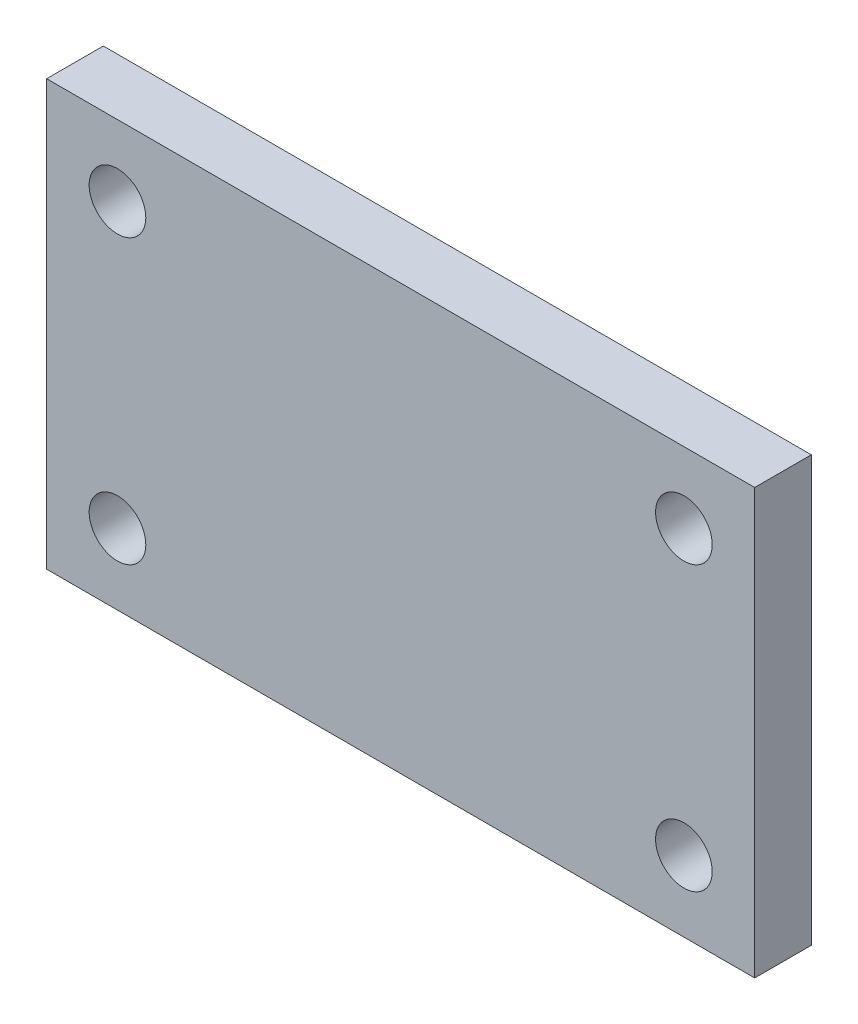
ISO-10303-21;
HEADER;
FILE_DESCRIPTION(('STEP AP214'),'2;1');
FILE_NAME('part.step','',(''),(''),'','','');
FILE_SCHEMA(('AUTOMOTIVE_DESIGN { 1 0 10303 214 1 1 1 1 }'));
ENDSEC;
DATA;
#1=APPLICATION_CONTEXT('core data for automotive mechanical design processes');
#2=APPLICATION_PROTOCOL_DEFINITION('international standard','automotive_design',2000,#1);
#3=PRODUCT_CONTEXT('',#1,'mechanical');
#4=PRODUCT('Part','Part','',(#3));
#5=PRODUCT_RELATED_PRODUCT_CATEGORY('part','',(#4));
#6=PRODUCT_DEFINITION_FORMATION('','',#4);
#7=PRODUCT_DEFINITION_CONTEXT('part definition',#1,'design');
#8=PRODUCT_DEFINITION('design','',#6,#7);
#9=PRODUCT_DEFINITION_SHAPE('','',#8);
#10=(LENGTH_UNIT() NAMED_UNIT(*) SI_UNIT(.MILLI.,.METRE.));
#11=(NAMED_UNIT(*) PLANE_ANGLE_UNIT() SI_UNIT($,.RADIAN.));
#12=(NAMED_UNIT(*) SI_UNIT($,.STERADIAN.) SOLID_ANGLE_UNIT());
#13=UNCERTAINTY_MEASURE_WITH_UNIT(LENGTH_MEASURE(1.E-05),#10,'distance_accuracy_value','');
#14=(GEOMETRIC_REPRESENTATION_CONTEXT(3) GLOBAL_UNCERTAINTY_ASSIGNED_CONTEXT((#13)) GLOBAL_UNIT_ASSIGNED_CONTEXT((#10,
#11,#12)) REPRESENTATION_CONTEXT('',''));
#15=CARTESIAN_POINT('',(0.,0.,0.));
#16=DIRECTION('',(0.,0.,1.));
#17=DIRECTION('',(1.,0.,0.));
#18=AXIS2_PLACEMENT_3D('',#15,#16,#17);
#19=CARTESIAN_POINT('',(40.,20.,0.));
#20=DIRECTION('',(0.,0.,-1.));
#21=DIRECTION('',(1.,0.,0.));
#22=AXIS2_PLACEMENT_3D('',#19,#20,#21);
#23=CYLINDRICAL_SURFACE('',#22,4.);
#24=CARTESIAN_POINT('',(40.,20.,0.));
#25=DIRECTION('',(0.,0.,1.));
#26=DIRECTION('',(1.,0.,0.));
#27=AXIS2_PLACEMENT_3D('',#24,#25,#26);
#28=CIRCLE('',#27,4.);
#29=CARTESIAN_POINT('',(44.,20.,0.));
#30=VERTEX_POINT('',#29);
#31=EDGE_CURVE('E65',#30,#30,#28,.T.);
#32=ORIENTED_EDGE('',*,*,#31,.F.);
#33=DIRECTION('',(0.,0.,1.));
#34=VECTOR('',#33,1.);
#35=CARTESIAN_POINT('',(44.,20.,0.));
#36=LINE('',#35,#34);
#37=CARTESIAN_POINT('',(44.,20.,8.));
#38=VERTEX_POINT('',#37);
#39=EDGE_CURVE('E10',#30,#38,#36,.T.);
#40=ORIENTED_EDGE('',*,*,#39,.T.);
#41=CARTESIAN_POINT('',(40.,20.,8.));
#42=DIRECTION('',(0.,0.,-1.));
#43=DIRECTION('',(1.,0.,0.));
#44=AXIS2_PLACEMENT_3D('',#41,#42,#43);
#45=CIRCLE('',#44,4.);
#46=EDGE_CURVE('E66',#38,#38,#45,.T.);
#47=ORIENTED_EDGE('',*,*,#46,.F.);
#48=ORIENTED_EDGE('',*,*,#39,.F.);
#49=EDGE_LOOP('',(#32,#40,#47,#48));
#50=FACE_BOUND('',#49,.T.);
#51=ADVANCED_FACE('F16',(#50),#23,.F.);
#52=CARTESIAN_POINT('',(-40.,20.,0.));
#53=DIRECTION('',(0.,0.,-1.));
#54=DIRECTION('',(1.,0.,0.));
#55=AXIS2_PLACEMENT_3D('',#52,#53,#54);
#56=CYLINDRICAL_SURFACE('',#55,4.);
#57=CARTESIAN_POINT('',(-40.,20.,0.));
#58=DIRECTION('',(0.,0.,1.));
#59=DIRECTION('',(1.,0.,0.));
#60=AXIS2_PLACEMENT_3D('',#57,#58,#59);
#61=CIRCLE('',#60,4.);
#62=CARTESIAN_POINT('',(-36.,20.,0.));
#63=VERTEX_POINT('',#62);
#64=EDGE_CURVE('E72',#63,#63,#61,.T.);
#65=ORIENTED_EDGE('',*,*,#64,.F.);
#66=DIRECTION('',(0.,0.,1.));
#67=VECTOR('',#66,1.);
#68=CARTESIAN_POINT('',(-36.,20.,0.));
#69=LINE('',#68,#67);
#70=CARTESIAN_POINT('',(-36.,20.,8.));
#71=VERTEX_POINT('',#70);
#72=EDGE_CURVE('E26',#63,#71,#69,.T.);
#73=ORIENTED_EDGE('',*,*,#72,.T.);
#74=CARTESIAN_POINT('',(-40.,20.,8.));
#75=DIRECTION('',(0.,0.,-1.));
#76=DIRECTION('',(1.,0.,0.));
#77=AXIS2_PLACEMENT_3D('',#74,#75,#76);
#78=CIRCLE('',#77,4.);
#79=EDGE_CURVE('E91',#71,#71,#78,.T.);
#80=ORIENTED_EDGE('',*,*,#79,.F.);
#81=ORIENTED_EDGE('',*,*,#72,.F.);
#82=EDGE_LOOP('',(#65,#73,#80,#81));
#83=FACE_BOUND('',#82,.T.);
#84=ADVANCED_FACE('F103',(#83),#56,.F.);
#85=CARTESIAN_POINT('',(40.,-20.,0.));
#86=DIRECTION('',(0.,0.,-1.));
#87=DIRECTION('',(1.,0.,0.));
#88=AXIS2_PLACEMENT_3D('',#85,#86,#87);
#89=CYLINDRICAL_SURFACE('',#88,4.);
#90=CARTESIAN_POINT('',(40.,-20.,0.));
#91=DIRECTION('',(0.,0.,1.));
#92=DIRECTION('',(1.,0.,0.));
#93=AXIS2_PLACEMENT_3D('',#90,#91,#92);
#94=CIRCLE('',#93,4.);
#95=CARTESIAN_POINT('',(44.,-20.,0.));
#96=VERTEX_POINT('',#95);
#97=EDGE_CURVE('E81',#96,#96,#94,.T.);
#98=ORIENTED_EDGE('',*,*,#97,.F.);
#99=DIRECTION('',(0.,0.,1.));
#100=VECTOR('',#99,1.);
#101=CARTESIAN_POINT('',(44.,-20.,0.));
#102=LINE('',#101,#100);
#103=CARTESIAN_POINT('',(44.,-20.,8.));
#104=VERTEX_POINT('',#103);
#105=EDGE_CURVE('E97',#96,#104,#102,.T.);
#106=ORIENTED_EDGE('',*,*,#105,.T.);
#107=CARTESIAN_POINT('',(40.,-20.,8.));
#108=DIRECTION('',(0.,0.,-1.));
#109=DIRECTION('',(1.,0.,0.));
#110=AXIS2_PLACEMENT_3D('',#107,#108,#109);
#111=CIRCLE('',#110,4.);
#112=EDGE_CURVE('E87',#104,#104,#111,.T.);
#113=ORIENTED_EDGE('',*,*,#112,.F.);
#114=ORIENTED_EDGE('',*,*,#105,.F.);
#115=EDGE_LOOP('',(#98,#106,#113,#114));
#116=FACE_BOUND('',#115,.T.);
#117=ADVANCED_FACE('F18',(#116),#89,.F.);
#118=CARTESIAN_POINT('',(-40.,-20.,0.));
#119=DIRECTION('',(0.,0.,-1.));
#120=DIRECTION('',(1.,0.,0.));
#121=AXIS2_PLACEMENT_3D('',#118,#119,#120);
#122=CYLINDRICAL_SURFACE('',#121,4.);
#123=CARTESIAN_POINT('',(-40.,-20.,0.));
#124=DIRECTION('',(0.,0.,1.));
#125=DIRECTION('',(1.,0.,0.));
#126=AXIS2_PLACEMENT_3D('',#123,#124,#125);
#127=CIRCLE('',#126,4.);
#128=CARTESIAN_POINT('',(-36.,-20.,0.));
#129=VERTEX_POINT('',#128);
#130=EDGE_CURVE('E147',#129,#129,#127,.T.);
#131=ORIENTED_EDGE('',*,*,#130,.F.);
#132=DIRECTION('',(0.,0.,1.));
#133=VECTOR('',#132,1.);
#134=CARTESIAN_POINT('',(-36.,-20.,0.));
#135=LINE('',#134,#133);
#136=CARTESIAN_POINT('',(-36.,-20.,8.));
#137=VERTEX_POINT('',#136);
#138=EDGE_CURVE('E94',#129,#137,#135,.T.);
#139=ORIENTED_EDGE('',*,*,#138,.T.);
#140=CARTESIAN_POINT('',(-40.,-20.,8.));
#141=DIRECTION('',(0.,0.,-1.));
#142=DIRECTION('',(1.,0.,0.));
#143=AXIS2_PLACEMENT_3D('',#140,#141,#142);
#144=CIRCLE('',#143,4.);
#145=EDGE_CURVE('E79',#137,#137,#144,.T.);
#146=ORIENTED_EDGE('',*,*,#145,.F.);
#147=ORIENTED_EDGE('',*,*,#138,.F.);
#148=EDGE_LOOP('',(#131,#139,#146,#147));
#149=FACE_BOUND('',#148,.T.);
#150=ADVANCED_FACE('F242',(#149),#122,.F.);
#151=CARTESIAN_POINT('',(50.,30.,0.));
#152=DIRECTION('',(0.,-1.,0.));
#153=DIRECTION('',(0.,0.,-1.));
#154=AXIS2_PLACEMENT_3D('',#151,#152,#153);
#155=PLANE('',#154);
#156=DIRECTION('',(-1.,0.,0.));
#157=VECTOR('',#156,1.);
#158=CARTESIAN_POINT('',(50.,30.,0.));
#159=LINE('',#158,#157);
#160=CARTESIAN_POINT('',(50.,30.,0.));
#161=VERTEX_POINT('',#160);
#162=CARTESIAN_POINT('',(-50.,30.,0.));
#163=VERTEX_POINT('',#162);
#164=EDGE_CURVE('E139',#161,#163,#159,.T.);
#165=ORIENTED_EDGE('',*,*,#164,.T.);
#166=DIRECTION('',(0.,0.,1.));
#167=VECTOR('',#166,1.);
#168=CARTESIAN_POINT('',(-50.,30.,0.));
#169=LINE('',#168,#167);
#170=CARTESIAN_POINT('',(-50.,30.,8.));
#171=VERTEX_POINT('',#170);
#172=EDGE_CURVE('E115',#163,#171,#169,.T.);
#173=ORIENTED_EDGE('',*,*,#172,.T.);
#174=DIRECTION('',(-1.,0.,0.));
#175=VECTOR('',#174,1.);
#176=CARTESIAN_POINT('',(50.,30.,8.));
#177=LINE('',#176,#175);
#178=CARTESIAN_POINT('',(50.,30.,8.));
#179=VERTEX_POINT('',#178);
#180=EDGE_CURVE('E71',#179,#171,#177,.T.);
#181=ORIENTED_EDGE('',*,*,#180,.F.);
#182=DIRECTION('',(0.,0.,1.));
#183=VECTOR('',#182,1.);
#184=CARTESIAN_POINT('',(50.,30.,0.));
#185=LINE('',#184,#183);
#186=EDGE_CURVE('E140',#161,#179,#185,.T.);
#187=ORIENTED_EDGE('',*,*,#186,.F.);
#188=EDGE_LOOP('',(#165,#173,#181,#187));
#189=FACE_BOUND('',#188,.T.);
#190=ADVANCED_FACE('F164',(#189),#155,.F.);
#191=CARTESIAN_POINT('',(0.,0.,8.));
#192=DIRECTION('',(0.,0.,1.));
#193=DIRECTION('',(1.,0.,0.));
#194=AXIS2_PLACEMENT_3D('',#191,#192,#193);
#195=PLANE('',#194);
#196=ORIENTED_EDGE('',*,*,#46,.T.);
#197=EDGE_LOOP('',(#196));
#198=FACE_BOUND('',#197,.T.);
#199=ORIENTED_EDGE('',*,*,#79,.T.);
#200=EDGE_LOOP('',(#199));
#201=FACE_BOUND('',#200,.T.);
#202=ORIENTED_EDGE('',*,*,#112,.T.);
#203=EDGE_LOOP('',(#202));
#204=FACE_BOUND('',#203,.T.);
#205=ORIENTED_EDGE('',*,*,#145,.T.);
#206=EDGE_LOOP('',(#205));
#207=FACE_BOUND('',#206,.T.);
#208=DIRECTION('',(1.,0.,0.));
#209=VECTOR('',#208,1.);
#210=CARTESIAN_POINT('',(-50.,-30.,8.));
#211=LINE('',#210,#209);
#212=CARTESIAN_POINT('',(-50.,-30.,8.));
#213=VERTEX_POINT('',#212);
#214=CARTESIAN_POINT('',(50.,-30.,8.));
#215=VERTEX_POINT('',#214);
#216=EDGE_CURVE('E120',#213,#215,#211,.T.);
#217=ORIENTED_EDGE('',*,*,#216,.T.);
#218=DIRECTION('',(0.,1.,0.));
#219=VECTOR('',#218,1.);
#220=CARTESIAN_POINT('',(50.,-30.,8.));
#221=LINE('',#220,#219);
#222=EDGE_CURVE('E135',#215,#179,#221,.T.);
#223=ORIENTED_EDGE('',*,*,#222,.T.);
#224=ORIENTED_EDGE('',*,*,#180,.T.);
#225=DIRECTION('',(0.,-1.,0.));
#226=VECTOR('',#225,1.);
#227=CARTESIAN_POINT('',(-50.,30.,8.));
#228=LINE('',#227,#226);
#229=EDGE_CURVE('E119',#171,#213,#228,.T.);
#230=ORIENTED_EDGE('',*,*,#229,.T.);
#231=EDGE_LOOP('',(#217,#223,#224,#230));
#232=FACE_BOUND('',#231,.T.);
#233=ADVANCED_FACE('F105',(#198,#201,#204,#207,#232),#195,.T.);
#234=CARTESIAN_POINT('',(0.,0.,0.));
#235=DIRECTION('',(0.,0.,1.));
#236=DIRECTION('',(1.,0.,0.));
#237=AXIS2_PLACEMENT_3D('',#234,#235,#236);
#238=PLANE('',#237);
#239=ORIENTED_EDGE('',*,*,#31,.T.);
#240=EDGE_LOOP('',(#239));
#241=FACE_BOUND('',#240,.T.);
#242=ORIENTED_EDGE('',*,*,#64,.T.);
#243=EDGE_LOOP('',(#242));
#244=FACE_BOUND('',#243,.T.);
#245=ORIENTED_EDGE('',*,*,#97,.T.);
#246=EDGE_LOOP('',(#245));
#247=FACE_BOUND('',#246,.T.);
#248=ORIENTED_EDGE('',*,*,#130,.T.);
#249=EDGE_LOOP('',(#248));
#250=FACE_BOUND('',#249,.T.);
#251=DIRECTION('',(0.,-1.,0.));
#252=VECTOR('',#251,1.);
#253=CARTESIAN_POINT('',(-50.,30.,0.));
#254=LINE('',#253,#252);
#255=CARTESIAN_POINT('',(-50.,-30.,0.));
#256=VERTEX_POINT('',#255);
#257=EDGE_CURVE('E128',#163,#256,#254,.T.);
#258=ORIENTED_EDGE('',*,*,#257,.F.);
#259=ORIENTED_EDGE('',*,*,#164,.F.);
#260=DIRECTION('',(0.,1.,0.));
#261=VECTOR('',#260,1.);
#262=CARTESIAN_POINT('',(50.,-30.,0.));
#263=LINE('',#262,#261);
#264=CARTESIAN_POINT('',(50.,-30.,0.));
#265=VERTEX_POINT('',#264);
#266=EDGE_CURVE('E118',#265,#161,#263,.T.);
#267=ORIENTED_EDGE('',*,*,#266,.F.);
#268=DIRECTION('',(1.,0.,0.));
#269=VECTOR('',#268,1.);
#270=CARTESIAN_POINT('',(-50.,-30.,0.));
#271=LINE('',#270,#269);
#272=EDGE_CURVE('E185',#256,#265,#271,.T.);
#273=ORIENTED_EDGE('',*,*,#272,.F.);
#274=EDGE_LOOP('',(#258,#259,#267,#273));
#275=FACE_BOUND('',#274,.T.);
#276=ADVANCED_FACE('F68',(#241,#244,#247,#250,#275),#238,.F.);
#277=CARTESIAN_POINT('',(50.,-30.,0.));
#278=DIRECTION('',(-1.,0.,0.));
#279=DIRECTION('',(0.,0.,1.));
#280=AXIS2_PLACEMENT_3D('',#277,#278,#279);
#281=PLANE('',#280);
#282=ORIENTED_EDGE('',*,*,#266,.T.);
#283=ORIENTED_EDGE('',*,*,#186,.T.);
#284=ORIENTED_EDGE('',*,*,#222,.F.);
#285=DIRECTION('',(0.,0.,1.));
#286=VECTOR('',#285,1.);
#287=CARTESIAN_POINT('',(50.,-30.,0.));
#288=LINE('',#287,#286);
#289=EDGE_CURVE('E114',#265,#215,#288,.T.);
#290=ORIENTED_EDGE('',*,*,#289,.F.);
#291=EDGE_LOOP('',(#282,#283,#284,#290));
#292=FACE_BOUND('',#291,.T.);
#293=ADVANCED_FACE('F194',(#292),#281,.F.);
#294=CARTESIAN_POINT('',(-50.,30.,0.));
#295=DIRECTION('',(1.,0.,0.));
#296=DIRECTION('',(0.,1.,0.));
#297=AXIS2_PLACEMENT_3D('',#294,#295,#296);
#298=PLANE('',#297);
#299=ORIENTED_EDGE('',*,*,#257,.T.);
#300=DIRECTION('',(0.,0.,1.));
#301=VECTOR('',#300,1.);
#302=CARTESIAN_POINT('',(-50.,-30.,0.));
#303=LINE('',#302,#301);
#304=EDGE_CURVE('E124',#256,#213,#303,.T.);
#305=ORIENTED_EDGE('',*,*,#304,.T.);
#306=ORIENTED_EDGE('',*,*,#229,.F.);
#307=ORIENTED_EDGE('',*,*,#172,.F.);
#308=EDGE_LOOP('',(#299,#305,#306,#307));
#309=FACE_BOUND('',#308,.T.);
#310=ADVANCED_FACE('F225',(#309),#298,.F.);
#311=CARTESIAN_POINT('',(-50.,-30.,0.));
#312=DIRECTION('',(0.,1.,0.));
#313=DIRECTION('',(1.,0.,0.));
#314=AXIS2_PLACEMENT_3D('',#311,#312,#313);
#315=PLANE('',#314);
#316=ORIENTED_EDGE('',*,*,#272,.T.);
#317=ORIENTED_EDGE('',*,*,#289,.T.);
#318=ORIENTED_EDGE('',*,*,#216,.F.);
#319=ORIENTED_EDGE('',*,*,#304,.F.);
#320=EDGE_LOOP('',(#316,#317,#318,#319));
#321=FACE_BOUND('',#320,.T.);
#322=ADVANCED_FACE('F183',(#321),#315,.F.);
#323=CLOSED_SHELL('',(#51,#84,#117,#150,#190,#233,#276,#293,#310,#322));
#324=MANIFOLD_SOLID_BREP('B1',#323);
#325=ADVANCED_BREP_SHAPE_REPRESENTATION('',(#18,#324),#14);
#326=SHAPE_DEFINITION_REPRESENTATION(#9,#325);
ENDSEC;
END-ISO-10303-21;
